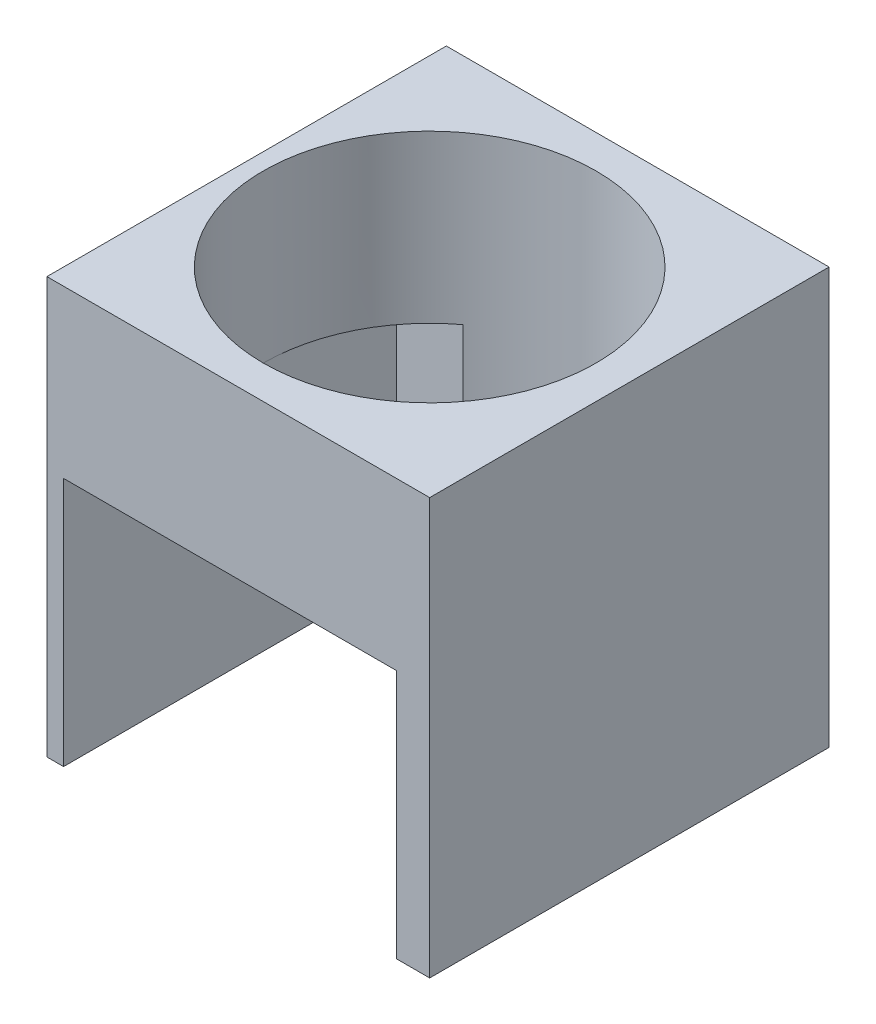
ISO-10303-21;
HEADER;
FILE_DESCRIPTION(('STEP AP214'),'2;1');
FILE_NAME('part.step','',(''),(''),'','','');
FILE_SCHEMA(('AUTOMOTIVE_DESIGN { 1 0 10303 214 1 1 1 1 }'));
ENDSEC;
DATA;
#1=APPLICATION_CONTEXT('core data for automotive mechanical design processes');
#2=APPLICATION_PROTOCOL_DEFINITION('international standard','automotive_design',2000,#1);
#3=PRODUCT_CONTEXT('',#1,'mechanical');
#4=PRODUCT('Part','Part','',(#3));
#5=PRODUCT_RELATED_PRODUCT_CATEGORY('part','',(#4));
#6=PRODUCT_DEFINITION_FORMATION('','',#4);
#7=PRODUCT_DEFINITION_CONTEXT('part definition',#1,'design');
#8=PRODUCT_DEFINITION('design','',#6,#7);
#9=PRODUCT_DEFINITION_SHAPE('','',#8);
#10=(LENGTH_UNIT() NAMED_UNIT(*) SI_UNIT(.MILLI.,.METRE.));
#11=(NAMED_UNIT(*) PLANE_ANGLE_UNIT() SI_UNIT($,.RADIAN.));
#12=(NAMED_UNIT(*) SI_UNIT($,.STERADIAN.) SOLID_ANGLE_UNIT());
#13=UNCERTAINTY_MEASURE_WITH_UNIT(LENGTH_MEASURE(1.E-05),#10,'distance_accuracy_value','');
#14=(GEOMETRIC_REPRESENTATION_CONTEXT(3) GLOBAL_UNCERTAINTY_ASSIGNED_CONTEXT((#13)) GLOBAL_UNIT_ASSIGNED_CONTEXT((#10,
#11,#12)) REPRESENTATION_CONTEXT('',''));
#15=CARTESIAN_POINT('',(0.,0.,0.));
#16=DIRECTION('',(0.,0.,1.));
#17=DIRECTION('',(1.,0.,0.));
#18=AXIS2_PLACEMENT_3D('',#15,#16,#17);
#19=CARTESIAN_POINT('',(0.,530.,0.));
#20=DIRECTION('',(0.,0.,-1.));
#21=DIRECTION('',(-1.,0.,0.));
#22=AXIS2_PLACEMENT_3D('',#19,#20,#21);
#23=PLANE('',#22);
#24=DIRECTION('',(0.,1.,0.));
#25=VECTOR('',#24,1.);
#26=CARTESIAN_POINT('',(555.,530.,0.));
#27=LINE('',#26,#25);
#28=CARTESIAN_POINT('',(555.,405.,0.));
#29=VERTEX_POINT('',#28);
#30=CARTESIAN_POINT('',(555.,530.,0.));
#31=VERTEX_POINT('',#30);
#32=EDGE_CURVE('E224',#29,#31,#27,.T.);
#33=ORIENTED_EDGE('',*,*,#32,.F.);
#34=DIRECTION('',(1.,0.,0.));
#35=VECTOR('',#34,1.);
#36=CARTESIAN_POINT('',(0.,405.,0.));
#37=LINE('',#36,#35);
#38=CARTESIAN_POINT('',(560.,405.,0.));
#39=VERTEX_POINT('',#38);
#40=EDGE_CURVE('E53',#29,#39,#37,.T.);
#41=ORIENTED_EDGE('',*,*,#40,.T.);
#42=DIRECTION('',(0.,-1.,0.));
#43=VECTOR('',#42,1.);
#44=CARTESIAN_POINT('',(560.,280.,0.));
#45=LINE('',#44,#43);
#46=CARTESIAN_POINT('',(560.,480.,0.));
#47=VERTEX_POINT('',#46);
#48=EDGE_CURVE('E180',#47,#39,#45,.T.);
#49=ORIENTED_EDGE('',*,*,#48,.F.);
#50=DIRECTION('',(-1.,0.,0.));
#51=VECTOR('',#50,1.);
#52=CARTESIAN_POINT('',(560.,480.,0.));
#53=LINE('',#52,#51);
#54=CARTESIAN_POINT('',(660.,480.,0.));
#55=VERTEX_POINT('',#54);
#56=EDGE_CURVE('E190',#55,#47,#53,.T.);
#57=ORIENTED_EDGE('',*,*,#56,.F.);
#58=DIRECTION('',(0.,1.,0.));
#59=VECTOR('',#58,1.);
#60=CARTESIAN_POINT('',(660.,280.,0.));
#61=LINE('',#60,#59);
#62=CARTESIAN_POINT('',(660.,405.,0.));
#63=VERTEX_POINT('',#62);
#64=EDGE_CURVE('E187',#63,#55,#61,.T.);
#65=ORIENTED_EDGE('',*,*,#64,.F.);
#66=CARTESIAN_POINT('',(670.,405.,0.));
#67=VERTEX_POINT('',#66);
#68=EDGE_CURVE('E216',#63,#67,#37,.T.);
#69=ORIENTED_EDGE('',*,*,#68,.T.);
#70=DIRECTION('',(0.,-1.,0.));
#71=VECTOR('',#70,1.);
#72=CARTESIAN_POINT('',(670.,530.,0.));
#73=LINE('',#72,#71);
#74=CARTESIAN_POINT('',(670.,530.,0.));
#75=VERTEX_POINT('',#74);
#76=EDGE_CURVE('E139',#75,#67,#73,.T.);
#77=ORIENTED_EDGE('',*,*,#76,.F.);
#78=DIRECTION('',(1.,0.,0.));
#79=VECTOR('',#78,1.);
#80=CARTESIAN_POINT('',(0.,530.,0.));
#81=LINE('',#80,#79);
#82=EDGE_CURVE('E200',#31,#75,#81,.T.);
#83=ORIENTED_EDGE('',*,*,#82,.F.);
#84=EDGE_LOOP('',(#33,#41,#49,#57,#65,#69,#77,#83));
#85=FACE_BOUND('',#84,.T.);
#86=ADVANCED_FACE('F38',(#85),#23,.F.);
#87=CARTESIAN_POINT('',(0.,530.,-120.));
#88=DIRECTION('',(0.,0.,1.));
#89=DIRECTION('',(1.,0.,0.));
#90=AXIS2_PLACEMENT_3D('',#87,#88,#89);
#91=PLANE('',#90);
#92=DIRECTION('',(0.,-1.,0.));
#93=VECTOR('',#92,1.);
#94=CARTESIAN_POINT('',(670.,530.,-120.));
#95=LINE('',#94,#93);
#96=CARTESIAN_POINT('',(670.,530.,-120.));
#97=VERTEX_POINT('',#96);
#98=CARTESIAN_POINT('',(670.,405.,-120.));
#99=VERTEX_POINT('',#98);
#100=EDGE_CURVE('E136',#97,#99,#95,.T.);
#101=ORIENTED_EDGE('',*,*,#100,.T.);
#102=DIRECTION('',(-1.,0.,0.));
#103=VECTOR('',#102,1.);
#104=CARTESIAN_POINT('',(555.,405.,-120.));
#105=LINE('',#104,#103);
#106=CARTESIAN_POINT('',(555.,405.,-120.));
#107=VERTEX_POINT('',#106);
#108=EDGE_CURVE('E119',#99,#107,#105,.T.);
#109=ORIENTED_EDGE('',*,*,#108,.T.);
#110=DIRECTION('',(0.,-1.,0.));
#111=VECTOR('',#110,1.);
#112=CARTESIAN_POINT('',(555.,530.,-120.));
#113=LINE('',#112,#111);
#114=CARTESIAN_POINT('',(555.,530.,-120.));
#115=VERTEX_POINT('',#114);
#116=EDGE_CURVE('E245',#115,#107,#113,.T.);
#117=ORIENTED_EDGE('',*,*,#116,.F.);
#118=DIRECTION('',(-1.,0.,0.));
#119=VECTOR('',#118,1.);
#120=CARTESIAN_POINT('',(0.,530.,-120.));
#121=LINE('',#120,#119);
#122=EDGE_CURVE('E144',#97,#115,#121,.T.);
#123=ORIENTED_EDGE('',*,*,#122,.F.);
#124=EDGE_LOOP('',(#101,#109,#117,#123));
#125=FACE_BOUND('',#124,.T.);
#126=ADVANCED_FACE('F142',(#125),#91,.F.);
#127=CARTESIAN_POINT('',(0.,530.,0.));
#128=DIRECTION('',(0.,-1.,0.));
#129=DIRECTION('',(0.,0.,-1.));
#130=AXIS2_PLACEMENT_3D('',#127,#128,#129);
#131=PLANE('',#130);
#132=CARTESIAN_POINT('',(610.,530.,-60.));
#133=DIRECTION('',(0.,1.,0.));
#134=DIRECTION('',(0.,0.,1.));
#135=AXIS2_PLACEMENT_3D('',#132,#133,#134);
#136=CIRCLE('',#135,50.);
#137=CARTESIAN_POINT('',(610.,530.,-9.99999999999997));
#138=VERTEX_POINT('',#137);
#139=EDGE_CURVE('E249',#138,#138,#136,.T.);
#140=ORIENTED_EDGE('',*,*,#139,.F.);
#141=EDGE_LOOP('',(#140));
#142=FACE_BOUND('',#141,.T.);
#143=DIRECTION('',(0.,0.,-1.));
#144=VECTOR('',#143,1.);
#145=CARTESIAN_POINT('',(555.,530.,59.));
#146=LINE('',#145,#144);
#147=EDGE_CURVE('E212',#31,#115,#146,.T.);
#148=ORIENTED_EDGE('',*,*,#147,.F.);
#149=ORIENTED_EDGE('',*,*,#82,.T.);
#150=DIRECTION('',(0.,0.,-1.));
#151=VECTOR('',#150,1.);
#152=CARTESIAN_POINT('',(670.,530.,0.));
#153=LINE('',#152,#151);
#154=EDGE_CURVE('E150',#75,#97,#153,.T.);
#155=ORIENTED_EDGE('',*,*,#154,.T.);
#156=ORIENTED_EDGE('',*,*,#122,.T.);
#157=EDGE_LOOP('',(#148,#149,#155,#156));
#158=FACE_BOUND('',#157,.T.);
#159=ADVANCED_FACE('F210',(#142,#158),#131,.F.);
#160=CARTESIAN_POINT('',(560.,480.,-100.));
#161=DIRECTION('',(0.,1.,0.));
#162=DIRECTION('',(-1.,0.,0.));
#163=AXIS2_PLACEMENT_3D('',#160,#161,#162);
#164=PLANE('',#163);
#165=DIRECTION('',(0.,0.,1.));
#166=VECTOR('',#165,1.);
#167=CARTESIAN_POINT('',(660.,480.,-100.));
#168=LINE('',#167,#166);
#169=CARTESIAN_POINT('',(660.,480.,-100.));
#170=VERTEX_POINT('',#169);
#171=CARTESIAN_POINT('',(660.,480.,-60.));
#172=VERTEX_POINT('',#171);
#173=EDGE_CURVE('E202',#170,#172,#168,.T.);
#174=ORIENTED_EDGE('',*,*,#173,.T.);
#175=CARTESIAN_POINT('',(610.,480.,-60.));
#176=DIRECTION('',(0.,1.,0.));
#177=DIRECTION('',(-1.,0.,0.));
#178=AXIS2_PLACEMENT_3D('',#175,#176,#177);
#179=CIRCLE('',#178,50.);
#180=CARTESIAN_POINT('',(640.,480.,-100.));
#181=VERTEX_POINT('',#180);
#182=EDGE_CURVE('E191',#172,#181,#179,.T.);
#183=ORIENTED_EDGE('',*,*,#182,.T.);
#184=DIRECTION('',(-1.,0.,0.));
#185=VECTOR('',#184,1.);
#186=CARTESIAN_POINT('',(560.,480.,-100.));
#187=LINE('',#186,#185);
#188=EDGE_CURVE('E173',#170,#181,#187,.T.);
#189=ORIENTED_EDGE('',*,*,#188,.F.);
#190=EDGE_LOOP('',(#174,#183,#189));
#191=FACE_BOUND('',#190,.T.);
#192=ADVANCED_FACE('F262',(#191),#164,.F.);
#193=DIRECTION('',(0.,0.,1.));
#194=VECTOR('',#193,1.);
#195=CARTESIAN_POINT('',(560.,480.,-100.));
#196=LINE('',#195,#194);
#197=CARTESIAN_POINT('',(560.,480.,-60.));
#198=VERTEX_POINT('',#197);
#199=EDGE_CURVE('E201',#198,#47,#196,.T.);
#200=ORIENTED_EDGE('',*,*,#199,.F.);
#201=EDGE_CURVE('E255',#198,#172,#179,.T.);
#202=ORIENTED_EDGE('',*,*,#201,.T.);
#203=EDGE_CURVE('E186',#172,#55,#168,.T.);
#204=ORIENTED_EDGE('',*,*,#203,.T.);
#205=ORIENTED_EDGE('',*,*,#56,.T.);
#206=EDGE_LOOP('',(#200,#202,#204,#205));
#207=FACE_BOUND('',#206,.T.);
#208=ADVANCED_FACE('F276',(#207),#164,.F.);
#209=CARTESIAN_POINT('',(0.,0.,-100.));
#210=DIRECTION('',(0.,0.,1.));
#211=DIRECTION('',(1.,0.,0.));
#212=AXIS2_PLACEMENT_3D('',#209,#210,#211);
#213=PLANE('',#212);
#214=DIRECTION('',(-1.,0.,0.));
#215=VECTOR('',#214,1.);
#216=CARTESIAN_POINT('',(0.,405.,-100.));
#217=LINE('',#216,#215);
#218=CARTESIAN_POINT('',(660.,405.,-100.));
#219=VERTEX_POINT('',#218);
#220=CARTESIAN_POINT('',(640.,405.,-100.));
#221=VERTEX_POINT('',#220);
#222=EDGE_CURVE('E229',#219,#221,#217,.T.);
#223=ORIENTED_EDGE('',*,*,#222,.F.);
#224=DIRECTION('',(0.,1.,0.));
#225=VECTOR('',#224,1.);
#226=CARTESIAN_POINT('',(660.,280.,-100.));
#227=LINE('',#226,#225);
#228=EDGE_CURVE('E174',#219,#170,#227,.T.);
#229=ORIENTED_EDGE('',*,*,#228,.T.);
#230=ORIENTED_EDGE('',*,*,#188,.T.);
#231=DIRECTION('',(0.,1.,0.));
#232=VECTOR('',#231,1.);
#233=CARTESIAN_POINT('',(640.,270.,-100.));
#234=LINE('',#233,#232);
#235=EDGE_CURVE('E11',#221,#181,#234,.T.);
#236=ORIENTED_EDGE('',*,*,#235,.F.);
#237=EDGE_LOOP('',(#223,#229,#230,#236));
#238=FACE_BOUND('',#237,.T.);
#239=ADVANCED_FACE('F265',(#238),#213,.T.);
#240=CARTESIAN_POINT('',(670.,530.,0.));
#241=DIRECTION('',(-1.,0.,0.));
#242=DIRECTION('',(0.,0.,1.));
#243=AXIS2_PLACEMENT_3D('',#240,#241,#242);
#244=PLANE('',#243);
#245=ORIENTED_EDGE('',*,*,#76,.T.);
#246=DIRECTION('',(0.,0.,1.));
#247=VECTOR('',#246,1.);
#248=CARTESIAN_POINT('',(670.,405.,-120.));
#249=LINE('',#248,#247);
#250=EDGE_CURVE('E122',#99,#67,#249,.T.);
#251=ORIENTED_EDGE('',*,*,#250,.F.);
#252=ORIENTED_EDGE('',*,*,#100,.F.);
#253=ORIENTED_EDGE('',*,*,#154,.F.);
#254=EDGE_LOOP('',(#245,#251,#252,#253));
#255=FACE_BOUND('',#254,.T.);
#256=ADVANCED_FACE('F134',(#255),#244,.F.);
#257=CARTESIAN_POINT('',(560.,280.,-100.));
#258=DIRECTION('',(-1.,0.,0.));
#259=DIRECTION('',(0.,0.,1.));
#260=AXIS2_PLACEMENT_3D('',#257,#258,#259);
#261=PLANE('',#260);
#262=ORIENTED_EDGE('',*,*,#48,.T.);
#263=DIRECTION('',(0.,0.,-1.));
#264=VECTOR('',#263,1.);
#265=CARTESIAN_POINT('',(560.,405.,-100.));
#266=LINE('',#265,#264);
#267=CARTESIAN_POINT('',(560.,405.,-100.));
#268=VERTEX_POINT('',#267);
#269=EDGE_CURVE('E232',#39,#268,#266,.T.);
#270=ORIENTED_EDGE('',*,*,#269,.T.);
#271=DIRECTION('',(0.,-1.,0.));
#272=VECTOR('',#271,1.);
#273=CARTESIAN_POINT('',(560.,280.,-100.));
#274=LINE('',#273,#272);
#275=CARTESIAN_POINT('',(560.,480.,-100.));
#276=VERTEX_POINT('',#275);
#277=EDGE_CURVE('E179',#276,#268,#274,.T.);
#278=ORIENTED_EDGE('',*,*,#277,.F.);
#279=EDGE_CURVE('E170',#276,#198,#196,.T.);
#280=ORIENTED_EDGE('',*,*,#279,.T.);
#281=ORIENTED_EDGE('',*,*,#199,.T.);
#282=EDGE_LOOP('',(#262,#270,#278,#280,#281));
#283=FACE_BOUND('',#282,.T.);
#284=ADVANCED_FACE('F275',(#283),#261,.F.);
#285=CARTESIAN_POINT('',(580.,480.,-100.));
#286=VERTEX_POINT('',#285);
#287=EDGE_CURVE('E163',#286,#276,#187,.T.);
#288=ORIENTED_EDGE('',*,*,#287,.F.);
#289=EDGE_CURVE('E61',#286,#198,#179,.T.);
#290=ORIENTED_EDGE('',*,*,#289,.T.);
#291=ORIENTED_EDGE('',*,*,#279,.F.);
#292=EDGE_LOOP('',(#288,#290,#291));
#293=FACE_BOUND('',#292,.T.);
#294=ADVANCED_FACE('F167',(#293),#164,.F.);
#295=CARTESIAN_POINT('',(660.,280.,-100.));
#296=DIRECTION('',(1.,0.,0.));
#297=DIRECTION('',(0.,0.,-1.));
#298=AXIS2_PLACEMENT_3D('',#295,#296,#297);
#299=PLANE('',#298);
#300=ORIENTED_EDGE('',*,*,#228,.F.);
#301=DIRECTION('',(0.,0.,1.));
#302=VECTOR('',#301,1.);
#303=CARTESIAN_POINT('',(660.,405.,-100.));
#304=LINE('',#303,#302);
#305=EDGE_CURVE('E220',#219,#63,#304,.T.);
#306=ORIENTED_EDGE('',*,*,#305,.T.);
#307=ORIENTED_EDGE('',*,*,#64,.T.);
#308=ORIENTED_EDGE('',*,*,#203,.F.);
#309=ORIENTED_EDGE('',*,*,#173,.F.);
#310=EDGE_LOOP('',(#300,#306,#307,#308,#309));
#311=FACE_BOUND('',#310,.T.);
#312=ADVANCED_FACE('F269',(#311),#299,.F.);
#313=DIRECTION('',(-1.,0.,0.));
#314=VECTOR('',#313,1.);
#315=CARTESIAN_POINT('',(0.,405.,-100.));
#316=LINE('',#315,#314);
#317=CARTESIAN_POINT('',(580.,405.,-100.));
#318=VERTEX_POINT('',#317);
#319=EDGE_CURVE('E165',#318,#268,#316,.T.);
#320=ORIENTED_EDGE('',*,*,#319,.F.);
#321=DIRECTION('',(0.,1.,0.));
#322=VECTOR('',#321,1.);
#323=CARTESIAN_POINT('',(580.,270.,-100.));
#324=LINE('',#323,#322);
#325=EDGE_CURVE('E46',#286,#318,#324,.F.);
#326=ORIENTED_EDGE('',*,*,#325,.F.);
#327=ORIENTED_EDGE('',*,*,#287,.T.);
#328=ORIENTED_EDGE('',*,*,#277,.T.);
#329=EDGE_LOOP('',(#320,#326,#327,#328));
#330=FACE_BOUND('',#329,.T.);
#331=ADVANCED_FACE('F161',(#330),#213,.T.);
#332=CARTESIAN_POINT('',(610.,270.,-60.));
#333=DIRECTION('',(0.,1.,0.));
#334=DIRECTION('',(0.,0.,1.));
#335=AXIS2_PLACEMENT_3D('',#332,#333,#334);
#336=CYLINDRICAL_SURFACE('',#335,50.);
#337=ORIENTED_EDGE('',*,*,#139,.T.);
#338=EDGE_LOOP('',(#337));
#339=FACE_BOUND('',#338,.T.);
#340=ORIENTED_EDGE('',*,*,#325,.T.);
#341=CARTESIAN_POINT('',(610.,405.,-60.));
#342=DIRECTION('',(0.,1.,0.));
#343=DIRECTION('',(0.,0.,1.));
#344=AXIS2_PLACEMENT_3D('',#341,#342,#343);
#345=CIRCLE('',#344,50.);
#346=EDGE_CURVE('E156',#318,#221,#345,.F.);
#347=ORIENTED_EDGE('',*,*,#346,.T.);
#348=ORIENTED_EDGE('',*,*,#235,.T.);
#349=ORIENTED_EDGE('',*,*,#182,.F.);
#350=ORIENTED_EDGE('',*,*,#201,.F.);
#351=ORIENTED_EDGE('',*,*,#289,.F.);
#352=EDGE_LOOP('',(#340,#347,#348,#349,#350,#351));
#353=FACE_BOUND('',#352,.T.);
#354=ADVANCED_FACE('F155',(#339,#353),#336,.F.);
#355=CARTESIAN_POINT('',(555.,0.,59.));
#356=DIRECTION('',(-1.,0.,0.));
#357=DIRECTION('',(0.,0.,1.));
#358=AXIS2_PLACEMENT_3D('',#355,#356,#357);
#359=PLANE('',#358);
#360=DIRECTION('',(0.,0.,1.));
#361=VECTOR('',#360,1.);
#362=CARTESIAN_POINT('',(555.,405.,-120.));
#363=LINE('',#362,#361);
#364=EDGE_CURVE('E124',#107,#29,#363,.T.);
#365=ORIENTED_EDGE('',*,*,#364,.T.);
#366=ORIENTED_EDGE('',*,*,#32,.T.);
#367=ORIENTED_EDGE('',*,*,#147,.T.);
#368=ORIENTED_EDGE('',*,*,#116,.T.);
#369=EDGE_LOOP('',(#365,#366,#367,#368));
#370=FACE_BOUND('',#369,.T.);
#371=ADVANCED_FACE('F244',(#370),#359,.T.);
#372=CARTESIAN_POINT('',(555.,405.,-120.));
#373=DIRECTION('',(0.,1.,0.));
#374=DIRECTION('',(0.,0.,1.));
#375=AXIS2_PLACEMENT_3D('',#372,#373,#374);
#376=PLANE('',#375);
#377=ORIENTED_EDGE('',*,*,#305,.F.);
#378=ORIENTED_EDGE('',*,*,#222,.T.);
#379=ORIENTED_EDGE('',*,*,#346,.F.);
#380=ORIENTED_EDGE('',*,*,#319,.T.);
#381=ORIENTED_EDGE('',*,*,#269,.F.);
#382=ORIENTED_EDGE('',*,*,#40,.F.);
#383=ORIENTED_EDGE('',*,*,#364,.F.);
#384=ORIENTED_EDGE('',*,*,#108,.F.);
#385=ORIENTED_EDGE('',*,*,#250,.T.);
#386=ORIENTED_EDGE('',*,*,#68,.F.);
#387=EDGE_LOOP('',(#377,#378,#379,#380,#381,#382,#383,#384,#385,#386));
#388=FACE_BOUND('',#387,.T.);
#389=ADVANCED_FACE('F121',(#388),#376,.F.);
#390=CLOSED_SHELL('',(#86,#126,#159,#192,#208,#239,#256,#284,#294,#312,#331,#354,#371,#389));
#391=MANIFOLD_SOLID_BREP('B2',#390);
#392=ADVANCED_BREP_SHAPE_REPRESENTATION('',(#18,#391),#14);
#393=SHAPE_DEFINITION_REPRESENTATION(#9,#392);
ENDSEC;
END-ISO-10303-21;
